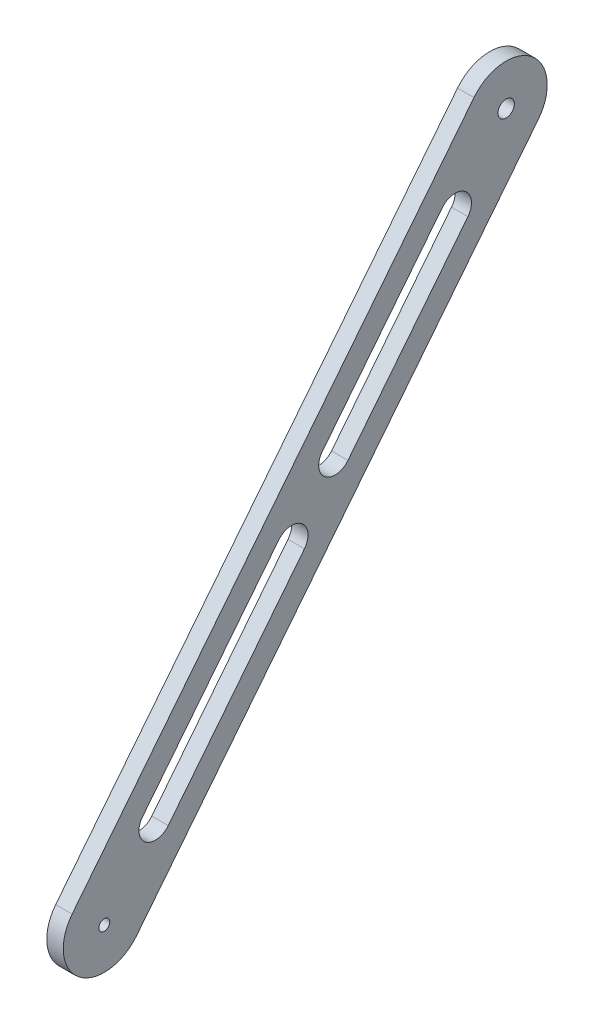
ISO-10303-21;
HEADER;
FILE_DESCRIPTION(('STEP AP214'),'2;1');
FILE_NAME('part.step','',(''),(''),'','','');
FILE_SCHEMA(('AUTOMOTIVE_DESIGN { 1 0 10303 214 1 1 1 1 }'));
ENDSEC;
DATA;
#1=APPLICATION_CONTEXT('core data for automotive mechanical design processes');
#2=APPLICATION_PROTOCOL_DEFINITION('international standard','automotive_design',2000,#1);
#3=PRODUCT_CONTEXT('',#1,'mechanical');
#4=PRODUCT('Part','Part','',(#3));
#5=PRODUCT_RELATED_PRODUCT_CATEGORY('part','',(#4));
#6=PRODUCT_DEFINITION_FORMATION('','',#4);
#7=PRODUCT_DEFINITION_CONTEXT('part definition',#1,'design');
#8=PRODUCT_DEFINITION('design','',#6,#7);
#9=PRODUCT_DEFINITION_SHAPE('','',#8);
#10=(LENGTH_UNIT() NAMED_UNIT(*) SI_UNIT(.MILLI.,.METRE.));
#11=(NAMED_UNIT(*) PLANE_ANGLE_UNIT() SI_UNIT($,.RADIAN.));
#12=(NAMED_UNIT(*) SI_UNIT($,.STERADIAN.) SOLID_ANGLE_UNIT());
#13=UNCERTAINTY_MEASURE_WITH_UNIT(LENGTH_MEASURE(1.E-05),#10,'distance_accuracy_value','');
#14=(GEOMETRIC_REPRESENTATION_CONTEXT(3) GLOBAL_UNCERTAINTY_ASSIGNED_CONTEXT((#13)) GLOBAL_UNIT_ASSIGNED_CONTEXT((#10,
#11,#12)) REPRESENTATION_CONTEXT('',''));
#15=CARTESIAN_POINT('',(0.,0.,0.));
#16=DIRECTION('',(0.,0.,1.));
#17=DIRECTION('',(1.,0.,0.));
#18=AXIS2_PLACEMENT_3D('',#15,#16,#17);
#19=CARTESIAN_POINT('',(-3.00000000000001,15.4,168.392394717891));
#20=DIRECTION('',(-1.,0.,0.));
#21=DIRECTION('',(0.,0.,1.));
#22=AXIS2_PLACEMENT_3D('',#19,#20,#21);
#23=PLANE('',#22);
#24=CARTESIAN_POINT('',(-3.00000000000001,107.821179898714,95.0280606983583));
#25=DIRECTION('',(-1.,0.,0.));
#26=DIRECTION('',(0.,0.,1.));
#27=AXIS2_PLACEMENT_3D('',#24,#25,#26);
#28=CIRCLE('',#27,1.49999999999911);
#29=CARTESIAN_POINT('',(-3.00000000000001,107.821179898714,96.5280606983574));
#30=VERTEX_POINT('',#29);
#31=EDGE_CURVE('E227',#30,#30,#28,.T.);
#32=ORIENTED_EDGE('',*,*,#31,.F.);
#33=EDGE_LOOP('',(#32));
#34=FACE_BOUND('',#33,.T.);
#35=CARTESIAN_POINT('',(-3.00000000000001,15.4,168.392394717891));
#36=DIRECTION('',(-1.,0.,0.));
#37=DIRECTION('',(0.,0.,1.));
#38=AXIS2_PLACEMENT_3D('',#35,#36,#37);
#39=CIRCLE('',#38,7.50000000000003);
#40=CARTESIAN_POINT('',(-3.00000000000001,10.73701266825,162.518167181955));
#41=VERTEX_POINT('',#40);
#42=CARTESIAN_POINT('',(-3.00000000000001,20.06298733175,174.266622253826));
#43=VERTEX_POINT('',#42);
#44=EDGE_CURVE('E235',#41,#43,#39,.T.);
#45=ORIENTED_EDGE('',*,*,#44,.T.);
#46=DIRECTION('',(0.,0.783230338124696,-0.621731644233325));
#47=VECTOR('',#46,1.);
#48=CARTESIAN_POINT('',(-3.00000000000001,20.06298733175,174.266622253826));
#49=LINE('',#48,#47);
#50=CARTESIAN_POINT('',(-3.00000000000001,112.484167230464,100.902288234293));
#51=VERTEX_POINT('',#50);
#52=EDGE_CURVE('E239',#43,#51,#49,.T.);
#53=ORIENTED_EDGE('',*,*,#52,.T.);
#54=CARTESIAN_POINT('',(-3.00000000000001,107.821179898714,95.0280606983583));
#55=DIRECTION('',(-1.,0.,0.));
#56=DIRECTION('',(0.,0.,1.));
#57=AXIS2_PLACEMENT_3D('',#54,#55,#56);
#58=CIRCLE('',#57,7.5);
#59=CARTESIAN_POINT('',(-3.00000000000001,103.158192566964,89.153833162423));
#60=VERTEX_POINT('',#59);
#61=EDGE_CURVE('E243',#51,#60,#58,.T.);
#62=ORIENTED_EDGE('',*,*,#61,.T.);
#63=DIRECTION('',(0.,-0.783230338124696,0.621731644233325));
#64=VECTOR('',#63,1.);
#65=CARTESIAN_POINT('',(-3.00000000000001,10.73701266825,162.518167181955));
#66=LINE('',#65,#64);
#67=EDGE_CURVE('E246',#60,#41,#66,.T.);
#68=ORIENTED_EDGE('',*,*,#67,.T.);
#69=EDGE_LOOP('',(#45,#53,#62,#68));
#70=FACE_BOUND('',#69,.T.);
#71=CARTESIAN_POINT('',(-3.00000000000001,15.4,168.392394717891));
#72=DIRECTION('',(-1.,0.,0.));
#73=DIRECTION('',(0.,0.,1.));
#74=AXIS2_PLACEMENT_3D('',#71,#72,#73);
#75=CIRCLE('',#74,0.999999999999998);
#76=CARTESIAN_POINT('',(-3.00000000000001,15.4,169.392394717891));
#77=VERTEX_POINT('',#76);
#78=EDGE_CURVE('E219',#77,#77,#75,.T.);
#79=ORIENTED_EDGE('',*,*,#78,.F.);
#80=EDGE_LOOP('',(#79));
#81=FACE_BOUND('',#80,.T.);
#82=DIRECTION('',(0.,-0.783230338124696,0.621731644233325));
#83=VECTOR('',#82,1.);
#84=CARTESIAN_POINT('',(-3.00000000000001,94.2075298941437,102.004344347484));
#85=LINE('',#84,#83);
#86=CARTESIAN_POINT('',(-3.00000000000001,94.2075298941437,102.004344347484));
#87=VERTEX_POINT('',#86);
#88=CARTESIAN_POINT('',(-3.00000000000001,66.6177756988394,123.905211059198));
#89=VERTEX_POINT('',#88);
#90=EDGE_CURVE('E180',#87,#89,#85,.T.);
#91=ORIENTED_EDGE('',*,*,#90,.F.);
#92=CARTESIAN_POINT('',(-3.00000000000001,96.0727248268437,104.354035361858));
#93=DIRECTION('',(-1.,0.,0.));
#94=DIRECTION('',(0.,0.,1.));
#95=AXIS2_PLACEMENT_3D('',#92,#93,#94);
#96=CIRCLE('',#95,3.00000000000002);
#97=CARTESIAN_POINT('',(-3.00000000000001,97.9379197595437,106.703726376232));
#98=VERTEX_POINT('',#97);
#99=EDGE_CURVE('E177',#98,#87,#96,.T.);
#100=ORIENTED_EDGE('',*,*,#99,.F.);
#101=DIRECTION('',(0.,0.783230338124697,-0.621731644233325));
#102=VECTOR('',#101,1.);
#103=CARTESIAN_POINT('',(-3.00000000000001,97.9379197595437,106.703726376232));
#104=LINE('',#103,#102);
#105=CARTESIAN_POINT('',(-3.00000000000001,70.3481655642394,128.604593087946));
#106=VERTEX_POINT('',#105);
#107=EDGE_CURVE('E187',#106,#98,#104,.T.);
#108=ORIENTED_EDGE('',*,*,#107,.F.);
#109=CARTESIAN_POINT('',(-3.00000000000001,68.4829706315394,126.254902073572));
#110=DIRECTION('',(-1.,0.,0.));
#111=DIRECTION('',(0.,0.,1.));
#112=AXIS2_PLACEMENT_3D('',#109,#110,#111);
#113=CIRCLE('',#112,3.00000000000001);
#114=EDGE_CURVE('E184',#89,#106,#113,.T.);
#115=ORIENTED_EDGE('',*,*,#114,.F.);
#116=EDGE_LOOP('',(#91,#100,#108,#115));
#117=FACE_BOUND('',#116,.T.);
#118=DIRECTION('',(0.,-0.783230338124696,0.621731644233326));
#119=VECTOR('',#118,1.);
#120=CARTESIAN_POINT('',(-3.00000000000001,56.6124736641583,131.847463270684));
#121=LINE('',#120,#119);
#122=CARTESIAN_POINT('',(-3.00000000000001,56.6124736641583,131.847463270684));
#123=VERTEX_POINT('',#122);
#124=CARTESIAN_POINT('',(-3.00000000000001,25.2832601391705,156.716729040017));
#125=VERTEX_POINT('',#124);
#126=EDGE_CURVE('E136',#123,#125,#121,.T.);
#127=ORIENTED_EDGE('',*,*,#126,.F.);
#128=CARTESIAN_POINT('',(-3.00000000000001,58.4776685968583,134.197154285058));
#129=DIRECTION('',(-1.,0.,0.));
#130=DIRECTION('',(0.,0.,1.));
#131=AXIS2_PLACEMENT_3D('',#128,#129,#130);
#132=CIRCLE('',#131,3.00000000000002);
#133=CARTESIAN_POINT('',(-3.00000000000001,60.3428635295583,136.546845299432));
#134=VERTEX_POINT('',#133);
#135=EDGE_CURVE('E127',#134,#123,#132,.T.);
#136=ORIENTED_EDGE('',*,*,#135,.F.);
#137=DIRECTION('',(0.,0.783230338124697,-0.621731644233325));
#138=VECTOR('',#137,1.);
#139=CARTESIAN_POINT('',(-3.00000000000001,60.3428635295583,136.546845299432));
#140=LINE('',#139,#138);
#141=CARTESIAN_POINT('',(-3.00000000000001,29.0136500045704,161.416111068765));
#142=VERTEX_POINT('',#141);
#143=EDGE_CURVE('E155',#142,#134,#140,.T.);
#144=ORIENTED_EDGE('',*,*,#143,.F.);
#145=CARTESIAN_POINT('',(-3.00000000000001,27.1484550718704,159.066420054391));
#146=DIRECTION('',(-1.,0.,0.));
#147=DIRECTION('',(0.,0.,1.));
#148=AXIS2_PLACEMENT_3D('',#145,#146,#147);
#149=CIRCLE('',#148,2.99999999999998);
#150=EDGE_CURVE('E149',#125,#142,#149,.T.);
#151=ORIENTED_EDGE('',*,*,#150,.F.);
#152=EDGE_LOOP('',(#127,#136,#144,#151));
#153=FACE_BOUND('',#152,.T.);
#154=ADVANCED_FACE('F37',(#34,#70,#81,#117,#153),#23,.T.);
#155=CARTESIAN_POINT('',(0.,15.4,168.392394717891));
#156=DIRECTION('',(-1.,0.,0.));
#157=DIRECTION('',(0.,0.,1.));
#158=AXIS2_PLACEMENT_3D('',#155,#156,#157);
#159=PLANE('',#158);
#160=CARTESIAN_POINT('',(0.,96.0727248268437,104.354035361858));
#161=DIRECTION('',(-1.,0.,0.));
#162=DIRECTION('',(0.,0.,1.));
#163=AXIS2_PLACEMENT_3D('',#160,#161,#162);
#164=CIRCLE('',#163,3.00000000000002);
#165=CARTESIAN_POINT('',(0.,97.9379197595437,106.703726376232));
#166=VERTEX_POINT('',#165);
#167=CARTESIAN_POINT('',(0.,94.2075298941437,102.004344347484));
#168=VERTEX_POINT('',#167);
#169=EDGE_CURVE('E145',#166,#168,#164,.T.);
#170=ORIENTED_EDGE('',*,*,#169,.T.);
#171=DIRECTION('',(0.,-0.783230338124696,0.621731644233325));
#172=VECTOR('',#171,1.);
#173=CARTESIAN_POINT('',(0.,94.2075298941437,102.004344347484));
#174=LINE('',#173,#172);
#175=CARTESIAN_POINT('',(0.,66.6177756988394,123.905211059198));
#176=VERTEX_POINT('',#175);
#177=EDGE_CURVE('E194',#168,#176,#174,.T.);
#178=ORIENTED_EDGE('',*,*,#177,.T.);
#179=CARTESIAN_POINT('',(0.,68.4829706315394,126.254902073572));
#180=DIRECTION('',(-1.,0.,0.));
#181=DIRECTION('',(0.,0.,1.));
#182=AXIS2_PLACEMENT_3D('',#179,#180,#181);
#183=CIRCLE('',#182,3.00000000000001);
#184=CARTESIAN_POINT('',(0.,70.3481655642394,128.604593087946));
#185=VERTEX_POINT('',#184);
#186=EDGE_CURVE('E198',#176,#185,#183,.T.);
#187=ORIENTED_EDGE('',*,*,#186,.T.);
#188=DIRECTION('',(0.,0.783230338124697,-0.621731644233325));
#189=VECTOR('',#188,1.);
#190=CARTESIAN_POINT('',(0.,97.9379197595437,106.703726376232));
#191=LINE('',#190,#189);
#192=EDGE_CURVE('E181',#185,#166,#191,.T.);
#193=ORIENTED_EDGE('',*,*,#192,.T.);
#194=EDGE_LOOP('',(#170,#178,#187,#193));
#195=FACE_BOUND('',#194,.T.);
#196=CARTESIAN_POINT('',(0.,15.4,168.392394717891));
#197=DIRECTION('',(-1.,0.,0.));
#198=DIRECTION('',(0.,0.,1.));
#199=AXIS2_PLACEMENT_3D('',#196,#197,#198);
#200=CIRCLE('',#199,7.50000000000003);
#201=CARTESIAN_POINT('',(0.,10.73701266825,162.518167181955));
#202=VERTEX_POINT('',#201);
#203=CARTESIAN_POINT('',(0.,20.06298733175,174.266622253826));
#204=VERTEX_POINT('',#203);
#205=EDGE_CURVE('E231',#202,#204,#200,.T.);
#206=ORIENTED_EDGE('',*,*,#205,.F.);
#207=DIRECTION('',(0.,-0.783230338124696,0.621731644233325));
#208=VECTOR('',#207,1.);
#209=CARTESIAN_POINT('',(0.,10.73701266825,162.518167181955));
#210=LINE('',#209,#208);
#211=CARTESIAN_POINT('',(0.,103.158192566964,89.153833162423));
#212=VERTEX_POINT('',#211);
#213=EDGE_CURVE('E240',#212,#202,#210,.T.);
#214=ORIENTED_EDGE('',*,*,#213,.F.);
#215=CARTESIAN_POINT('',(0.,107.821179898714,95.0280606983583));
#216=DIRECTION('',(-1.,0.,0.));
#217=DIRECTION('',(0.,0.,1.));
#218=AXIS2_PLACEMENT_3D('',#215,#216,#217);
#219=CIRCLE('',#218,7.5);
#220=CARTESIAN_POINT('',(0.,112.484167230464,100.902288234293));
#221=VERTEX_POINT('',#220);
#222=EDGE_CURVE('E256',#221,#212,#219,.T.);
#223=ORIENTED_EDGE('',*,*,#222,.F.);
#224=DIRECTION('',(0.,0.783230338124696,-0.621731644233325));
#225=VECTOR('',#224,1.);
#226=CARTESIAN_POINT('',(0.,20.06298733175,174.266622253826));
#227=LINE('',#226,#225);
#228=EDGE_CURVE('E253',#204,#221,#227,.T.);
#229=ORIENTED_EDGE('',*,*,#228,.F.);
#230=EDGE_LOOP('',(#206,#214,#223,#229));
#231=FACE_BOUND('',#230,.T.);
#232=CARTESIAN_POINT('',(0.,107.821179898714,95.0280606983583));
#233=DIRECTION('',(-1.,0.,0.));
#234=DIRECTION('',(0.,0.,1.));
#235=AXIS2_PLACEMENT_3D('',#232,#233,#234);
#236=CIRCLE('',#235,1.49999999999911);
#237=CARTESIAN_POINT('',(0.,107.821179898714,96.5280606983574));
#238=VERTEX_POINT('',#237);
#239=EDGE_CURVE('E223',#238,#238,#236,.T.);
#240=ORIENTED_EDGE('',*,*,#239,.T.);
#241=EDGE_LOOP('',(#240));
#242=FACE_BOUND('',#241,.T.);
#243=CARTESIAN_POINT('',(0.,15.4,168.392394717891));
#244=DIRECTION('',(-1.,0.,0.));
#245=DIRECTION('',(0.,0.,1.));
#246=AXIS2_PLACEMENT_3D('',#243,#244,#245);
#247=CIRCLE('',#246,0.999999999999998);
#248=CARTESIAN_POINT('',(0.,15.4,169.392394717891));
#249=VERTEX_POINT('',#248);
#250=EDGE_CURVE('E218',#249,#249,#247,.T.);
#251=ORIENTED_EDGE('',*,*,#250,.T.);
#252=EDGE_LOOP('',(#251));
#253=FACE_BOUND('',#252,.T.);
#254=CARTESIAN_POINT('',(0.,58.4776685968583,134.197154285058));
#255=DIRECTION('',(-1.,0.,0.));
#256=DIRECTION('',(0.,0.,1.));
#257=AXIS2_PLACEMENT_3D('',#254,#255,#256);
#258=CIRCLE('',#257,3.00000000000002);
#259=CARTESIAN_POINT('',(0.,60.3428635295583,136.546845299432));
#260=VERTEX_POINT('',#259);
#261=CARTESIAN_POINT('',(0.,56.6124736641583,131.847463270684));
#262=VERTEX_POINT('',#261);
#263=EDGE_CURVE('E61',#260,#262,#258,.T.);
#264=ORIENTED_EDGE('',*,*,#263,.T.);
#265=DIRECTION('',(0.,-0.783230338124696,0.621731644233326));
#266=VECTOR('',#265,1.);
#267=CARTESIAN_POINT('',(0.,56.6124736641583,131.847463270684));
#268=LINE('',#267,#266);
#269=CARTESIAN_POINT('',(0.,25.2832601391705,156.716729040017));
#270=VERTEX_POINT('',#269);
#271=EDGE_CURVE('E143',#262,#270,#268,.T.);
#272=ORIENTED_EDGE('',*,*,#271,.T.);
#273=CARTESIAN_POINT('',(0.,27.1484550718704,159.066420054391));
#274=DIRECTION('',(-1.,0.,0.));
#275=DIRECTION('',(0.,0.,1.));
#276=AXIS2_PLACEMENT_3D('',#273,#274,#275);
#277=CIRCLE('',#276,2.99999999999998);
#278=CARTESIAN_POINT('',(0.,29.0136500045704,161.416111068765));
#279=VERTEX_POINT('',#278);
#280=EDGE_CURVE('E164',#270,#279,#277,.T.);
#281=ORIENTED_EDGE('',*,*,#280,.T.);
#282=DIRECTION('',(0.,0.783230338124697,-0.621731644233325));
#283=VECTOR('',#282,1.);
#284=CARTESIAN_POINT('',(0.,60.3428635295583,136.546845299432));
#285=LINE('',#284,#283);
#286=EDGE_CURVE('E137',#279,#260,#285,.T.);
#287=ORIENTED_EDGE('',*,*,#286,.T.);
#288=EDGE_LOOP('',(#264,#272,#281,#287));
#289=FACE_BOUND('',#288,.T.);
#290=ADVANCED_FACE('F280',(#195,#231,#242,#253,#289),#159,.F.);
#291=CARTESIAN_POINT('',(-3.00000000000001,15.4,168.392394717891));
#292=DIRECTION('',(1.,0.,0.));
#293=DIRECTION('',(0.,0.,-1.));
#294=AXIS2_PLACEMENT_3D('',#291,#292,#293);
#295=CYLINDRICAL_SURFACE('',#294,7.50000000000003);
#296=ORIENTED_EDGE('',*,*,#205,.T.);
#297=DIRECTION('',(1.,0.,0.));
#298=VECTOR('',#297,1.);
#299=CARTESIAN_POINT('',(-3.00000000000001,20.06298733175,174.266622253826));
#300=LINE('',#299,#298);
#301=EDGE_CURVE('E11',#43,#204,#300,.T.);
#302=ORIENTED_EDGE('',*,*,#301,.F.);
#303=ORIENTED_EDGE('',*,*,#44,.F.);
#304=DIRECTION('',(1.,0.,0.));
#305=VECTOR('',#304,1.);
#306=CARTESIAN_POINT('',(-3.00000000000001,10.73701266825,162.518167181955));
#307=LINE('',#306,#305);
#308=EDGE_CURVE('E249',#41,#202,#307,.T.);
#309=ORIENTED_EDGE('',*,*,#308,.T.);
#310=EDGE_LOOP('',(#296,#302,#303,#309));
#311=FACE_BOUND('',#310,.T.);
#312=ADVANCED_FACE('F39',(#311),#295,.T.);
#313=CARTESIAN_POINT('',(-3.00000000000001,20.06298733175,174.266622253826));
#314=DIRECTION('',(0.,-0.621731644233325,-0.783230338124696));
#315=DIRECTION('',(0.,0.783230338124696,-0.621731644233325));
#316=AXIS2_PLACEMENT_3D('',#313,#314,#315);
#317=PLANE('',#316);
#318=ORIENTED_EDGE('',*,*,#228,.T.);
#319=DIRECTION('',(1.,0.,0.));
#320=VECTOR('',#319,1.);
#321=CARTESIAN_POINT('',(-3.00000000000001,112.484167230464,100.902288234293));
#322=LINE('',#321,#320);
#323=EDGE_CURVE('E46',#51,#221,#322,.T.);
#324=ORIENTED_EDGE('',*,*,#323,.F.);
#325=ORIENTED_EDGE('',*,*,#52,.F.);
#326=ORIENTED_EDGE('',*,*,#301,.T.);
#327=EDGE_LOOP('',(#318,#324,#325,#326));
#328=FACE_BOUND('',#327,.T.);
#329=ADVANCED_FACE('F291',(#328),#317,.F.);
#330=CARTESIAN_POINT('',(-3.00000000000001,107.821179898714,95.0280606983583));
#331=DIRECTION('',(1.,0.,0.));
#332=DIRECTION('',(0.,0.,-1.));
#333=AXIS2_PLACEMENT_3D('',#330,#331,#332);
#334=CYLINDRICAL_SURFACE('',#333,7.5);
#335=ORIENTED_EDGE('',*,*,#222,.T.);
#336=DIRECTION('',(1.,0.,0.));
#337=VECTOR('',#336,1.);
#338=CARTESIAN_POINT('',(-3.00000000000001,103.158192566964,89.153833162423));
#339=LINE('',#338,#337);
#340=EDGE_CURVE('E264',#60,#212,#339,.T.);
#341=ORIENTED_EDGE('',*,*,#340,.F.);
#342=ORIENTED_EDGE('',*,*,#61,.F.);
#343=ORIENTED_EDGE('',*,*,#323,.T.);
#344=EDGE_LOOP('',(#335,#341,#342,#343));
#345=FACE_BOUND('',#344,.T.);
#346=ADVANCED_FACE('F274',(#345),#334,.T.);
#347=CARTESIAN_POINT('',(-3.00000000000001,10.73701266825,162.518167181955));
#348=DIRECTION('',(0.,0.621731644233325,0.783230338124696));
#349=DIRECTION('',(0.,-0.783230338124697,0.621731644233325));
#350=AXIS2_PLACEMENT_3D('',#347,#348,#349);
#351=PLANE('',#350);
#352=ORIENTED_EDGE('',*,*,#213,.T.);
#353=ORIENTED_EDGE('',*,*,#308,.F.);
#354=ORIENTED_EDGE('',*,*,#67,.F.);
#355=ORIENTED_EDGE('',*,*,#340,.T.);
#356=EDGE_LOOP('',(#352,#353,#354,#355));
#357=FACE_BOUND('',#356,.T.);
#358=ADVANCED_FACE('F284',(#357),#351,.F.);
#359=CARTESIAN_POINT('',(-3.00000000000001,107.821179898714,95.0280606983583));
#360=DIRECTION('',(1.,0.,0.));
#361=DIRECTION('',(0.,0.,-1.));
#362=AXIS2_PLACEMENT_3D('',#359,#360,#361);
#363=CYLINDRICAL_SURFACE('',#362,1.49999999999911);
#364=ORIENTED_EDGE('',*,*,#31,.T.);
#365=EDGE_LOOP('',(#364));
#366=FACE_BOUND('',#365,.T.);
#367=ORIENTED_EDGE('',*,*,#239,.F.);
#368=EDGE_LOOP('',(#367));
#369=FACE_BOUND('',#368,.T.);
#370=ADVANCED_FACE('F308',(#366,#369),#363,.F.);
#371=CARTESIAN_POINT('',(-3.00000000000001,15.4,168.392394717891));
#372=DIRECTION('',(1.,0.,0.));
#373=DIRECTION('',(0.,0.,-1.));
#374=AXIS2_PLACEMENT_3D('',#371,#372,#373);
#375=CYLINDRICAL_SURFACE('',#374,0.999999999999998);
#376=ORIENTED_EDGE('',*,*,#78,.T.);
#377=EDGE_LOOP('',(#376));
#378=FACE_BOUND('',#377,.T.);
#379=ORIENTED_EDGE('',*,*,#250,.F.);
#380=EDGE_LOOP('',(#379));
#381=FACE_BOUND('',#380,.T.);
#382=ADVANCED_FACE('F315',(#378,#381),#375,.F.);
#383=CARTESIAN_POINT('',(-3.00000000000001,96.0727248268437,104.354035361858));
#384=DIRECTION('',(1.,0.,0.));
#385=DIRECTION('',(0.,0.,-1.));
#386=AXIS2_PLACEMENT_3D('',#383,#384,#385);
#387=CYLINDRICAL_SURFACE('',#386,3.00000000000002);
#388=ORIENTED_EDGE('',*,*,#169,.F.);
#389=DIRECTION('',(1.,0.,0.));
#390=VECTOR('',#389,1.);
#391=CARTESIAN_POINT('',(-3.00000000000001,97.9379197595437,106.703726376232));
#392=LINE('',#391,#390);
#393=EDGE_CURVE('E190',#98,#166,#392,.T.);
#394=ORIENTED_EDGE('',*,*,#393,.F.);
#395=ORIENTED_EDGE('',*,*,#99,.T.);
#396=DIRECTION('',(1.,0.,0.));
#397=VECTOR('',#396,1.);
#398=CARTESIAN_POINT('',(-3.00000000000001,94.2075298941437,102.004344347484));
#399=LINE('',#398,#397);
#400=EDGE_CURVE('E214',#87,#168,#399,.T.);
#401=ORIENTED_EDGE('',*,*,#400,.T.);
#402=EDGE_LOOP('',(#388,#394,#395,#401));
#403=FACE_BOUND('',#402,.T.);
#404=ADVANCED_FACE('F320',(#403),#387,.F.);
#405=CARTESIAN_POINT('',(-3.00000000000001,94.2075298941437,102.004344347484));
#406=DIRECTION('',(0.,0.621731644233325,0.783230338124696));
#407=DIRECTION('',(0.,-0.783230338124696,0.621731644233326));
#408=AXIS2_PLACEMENT_3D('',#405,#406,#407);
#409=PLANE('',#408);
#410=ORIENTED_EDGE('',*,*,#177,.F.);
#411=ORIENTED_EDGE('',*,*,#400,.F.);
#412=ORIENTED_EDGE('',*,*,#90,.T.);
#413=DIRECTION('',(1.,0.,0.));
#414=VECTOR('',#413,1.);
#415=CARTESIAN_POINT('',(-3.00000000000001,66.6177756988394,123.905211059198));
#416=LINE('',#415,#414);
#417=EDGE_CURVE('E211',#89,#176,#416,.T.);
#418=ORIENTED_EDGE('',*,*,#417,.T.);
#419=EDGE_LOOP('',(#410,#411,#412,#418));
#420=FACE_BOUND('',#419,.T.);
#421=ADVANCED_FACE('F349',(#420),#409,.T.);
#422=CARTESIAN_POINT('',(-3.00000000000001,68.4829706315394,126.254902073572));
#423=DIRECTION('',(1.,0.,0.));
#424=DIRECTION('',(0.,0.,-1.));
#425=AXIS2_PLACEMENT_3D('',#422,#423,#424);
#426=CYLINDRICAL_SURFACE('',#425,3.00000000000001);
#427=ORIENTED_EDGE('',*,*,#186,.F.);
#428=ORIENTED_EDGE('',*,*,#417,.F.);
#429=ORIENTED_EDGE('',*,*,#114,.T.);
#430=DIRECTION('',(1.,0.,0.));
#431=VECTOR('',#430,1.);
#432=CARTESIAN_POINT('',(-3.00000000000001,70.3481655642394,128.604593087946));
#433=LINE('',#432,#431);
#434=EDGE_CURVE('E208',#106,#185,#433,.T.);
#435=ORIENTED_EDGE('',*,*,#434,.T.);
#436=EDGE_LOOP('',(#427,#428,#429,#435));
#437=FACE_BOUND('',#436,.T.);
#438=ADVANCED_FACE('F345',(#437),#426,.F.);
#439=CARTESIAN_POINT('',(-3.00000000000001,97.9379197595437,106.703726376232));
#440=DIRECTION('',(0.,-0.621731644233325,-0.783230338124697));
#441=DIRECTION('',(0.,0.783230338124697,-0.621731644233325));
#442=AXIS2_PLACEMENT_3D('',#439,#440,#441);
#443=PLANE('',#442);
#444=ORIENTED_EDGE('',*,*,#192,.F.);
#445=ORIENTED_EDGE('',*,*,#434,.F.);
#446=ORIENTED_EDGE('',*,*,#107,.T.);
#447=ORIENTED_EDGE('',*,*,#393,.T.);
#448=EDGE_LOOP('',(#444,#445,#446,#447));
#449=FACE_BOUND('',#448,.T.);
#450=ADVANCED_FACE('F342',(#449),#443,.T.);
#451=CARTESIAN_POINT('',(-3.00000000000001,58.4776685968583,134.197154285058));
#452=DIRECTION('',(1.,0.,0.));
#453=DIRECTION('',(0.,0.,-1.));
#454=AXIS2_PLACEMENT_3D('',#451,#452,#453);
#455=CYLINDRICAL_SURFACE('',#454,3.00000000000002);
#456=ORIENTED_EDGE('',*,*,#263,.F.);
#457=DIRECTION('',(1.,0.,0.));
#458=VECTOR('',#457,1.);
#459=CARTESIAN_POINT('',(-3.00000000000001,60.3428635295583,136.546845299432));
#460=LINE('',#459,#458);
#461=EDGE_CURVE('E131',#134,#260,#460,.T.);
#462=ORIENTED_EDGE('',*,*,#461,.F.);
#463=ORIENTED_EDGE('',*,*,#135,.T.);
#464=DIRECTION('',(1.,0.,0.));
#465=VECTOR('',#464,1.);
#466=CARTESIAN_POINT('',(-3.00000000000001,56.6124736641583,131.847463270684));
#467=LINE('',#466,#465);
#468=EDGE_CURVE('E130',#123,#262,#467,.T.);
#469=ORIENTED_EDGE('',*,*,#468,.T.);
#470=EDGE_LOOP('',(#456,#462,#463,#469));
#471=FACE_BOUND('',#470,.T.);
#472=ADVANCED_FACE('F129',(#471),#455,.F.);
#473=CARTESIAN_POINT('',(-3.00000000000001,56.6124736641583,131.847463270684));
#474=DIRECTION('',(0.,0.621731644233326,0.783230338124696));
#475=DIRECTION('',(0.,-0.783230338124696,0.621731644233326));
#476=AXIS2_PLACEMENT_3D('',#473,#474,#475);
#477=PLANE('',#476);
#478=ORIENTED_EDGE('',*,*,#271,.F.);
#479=ORIENTED_EDGE('',*,*,#468,.F.);
#480=ORIENTED_EDGE('',*,*,#126,.T.);
#481=DIRECTION('',(1.,0.,0.));
#482=VECTOR('',#481,1.);
#483=CARTESIAN_POINT('',(-3.00000000000001,25.2832601391705,156.716729040017));
#484=LINE('',#483,#482);
#485=EDGE_CURVE('E146',#125,#270,#484,.T.);
#486=ORIENTED_EDGE('',*,*,#485,.T.);
#487=EDGE_LOOP('',(#478,#479,#480,#486));
#488=FACE_BOUND('',#487,.T.);
#489=ADVANCED_FACE('F140',(#488),#477,.T.);
#490=CARTESIAN_POINT('',(-3.00000000000001,27.1484550718704,159.066420054391));
#491=DIRECTION('',(1.,0.,0.));
#492=DIRECTION('',(0.,0.,-1.));
#493=AXIS2_PLACEMENT_3D('',#490,#491,#492);
#494=CYLINDRICAL_SURFACE('',#493,2.99999999999998);
#495=ORIENTED_EDGE('',*,*,#280,.F.);
#496=ORIENTED_EDGE('',*,*,#485,.F.);
#497=ORIENTED_EDGE('',*,*,#150,.T.);
#498=DIRECTION('',(1.,0.,0.));
#499=VECTOR('',#498,1.);
#500=CARTESIAN_POINT('',(-3.00000000000001,29.0136500045704,161.416111068765));
#501=LINE('',#500,#499);
#502=EDGE_CURVE('E53',#142,#279,#501,.T.);
#503=ORIENTED_EDGE('',*,*,#502,.T.);
#504=EDGE_LOOP('',(#495,#496,#497,#503));
#505=FACE_BOUND('',#504,.T.);
#506=ADVANCED_FACE('F330',(#505),#494,.F.);
#507=CARTESIAN_POINT('',(-3.00000000000001,60.3428635295583,136.546845299432));
#508=DIRECTION('',(0.,-0.621731644233324,-0.783230338124697));
#509=DIRECTION('',(0.,0.783230338124697,-0.621731644233325));
#510=AXIS2_PLACEMENT_3D('',#507,#508,#509);
#511=PLANE('',#510);
#512=ORIENTED_EDGE('',*,*,#286,.F.);
#513=ORIENTED_EDGE('',*,*,#502,.F.);
#514=ORIENTED_EDGE('',*,*,#143,.T.);
#515=ORIENTED_EDGE('',*,*,#461,.T.);
#516=EDGE_LOOP('',(#512,#513,#514,#515));
#517=FACE_BOUND('',#516,.T.);
#518=ADVANCED_FACE('F328',(#517),#511,.T.);
#519=CLOSED_SHELL('',(#154,#290,#312,#329,#346,#358,#370,#382,#404,#421,#438,#450,#472,#489,
#506,#518));
#520=MANIFOLD_SOLID_BREP('B2',#519);
#521=ADVANCED_BREP_SHAPE_REPRESENTATION('',(#18,#520),#14);
#522=SHAPE_DEFINITION_REPRESENTATION(#9,#521);
ENDSEC;
END-ISO-10303-21;
